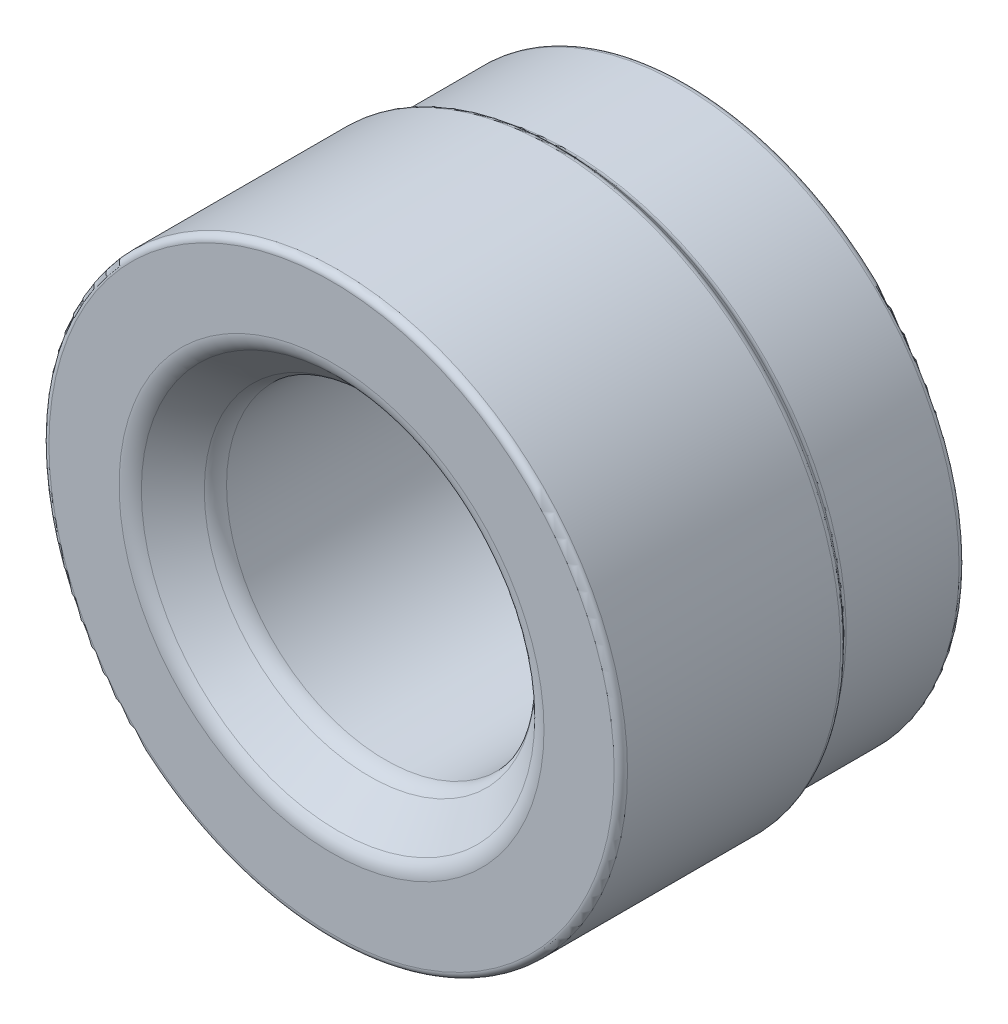
ISO-10303-21;
HEADER;
FILE_DESCRIPTION(('STEP AP214'),'2;1');
FILE_NAME('part.step','',(''),(''),'','','');
FILE_SCHEMA(('AUTOMOTIVE_DESIGN { 1 0 10303 214 1 1 1 1 }'));
ENDSEC;
DATA;
#1=APPLICATION_CONTEXT('core data for automotive mechanical design processes');
#2=APPLICATION_PROTOCOL_DEFINITION('international standard','automotive_design',2000,#1);
#3=PRODUCT_CONTEXT('',#1,'mechanical');
#4=PRODUCT('Part','Part','',(#3));
#5=PRODUCT_RELATED_PRODUCT_CATEGORY('part','',(#4));
#6=PRODUCT_DEFINITION_FORMATION('','',#4);
#7=PRODUCT_DEFINITION_CONTEXT('part definition',#1,'design');
#8=PRODUCT_DEFINITION('design','',#6,#7);
#9=PRODUCT_DEFINITION_SHAPE('','',#8);
#10=(LENGTH_UNIT() NAMED_UNIT(*) SI_UNIT(.MILLI.,.METRE.));
#11=(NAMED_UNIT(*) PLANE_ANGLE_UNIT() SI_UNIT($,.RADIAN.));
#12=(NAMED_UNIT(*) SI_UNIT($,.STERADIAN.) SOLID_ANGLE_UNIT());
#13=UNCERTAINTY_MEASURE_WITH_UNIT(LENGTH_MEASURE(1.E-05),#10,'distance_accuracy_value','');
#14=(GEOMETRIC_REPRESENTATION_CONTEXT(3) GLOBAL_UNCERTAINTY_ASSIGNED_CONTEXT((#13)) GLOBAL_UNIT_ASSIGNED_CONTEXT((#10,
#11,#12)) REPRESENTATION_CONTEXT('',''));
#15=CARTESIAN_POINT('',(0.,0.,0.));
#16=DIRECTION('',(0.,0.,1.));
#17=DIRECTION('',(1.,0.,0.));
#18=AXIS2_PLACEMENT_3D('',#15,#16,#17);
#19=CARTESIAN_POINT('',(0.,0.,8.76));
#20=DIRECTION('',(0.,0.,-1.));
#21=DIRECTION('',(-1.,0.,0.));
#22=AXIS2_PLACEMENT_3D('',#19,#20,#21);
#23=CYLINDRICAL_SURFACE('',#22,12.5);
#24=CARTESIAN_POINT('',(0.,0.,3.06));
#25=DIRECTION('',(0.,0.,1.));
#26=DIRECTION('',(1.,0.,0.));
#27=AXIS2_PLACEMENT_3D('',#24,#25,#26);
#28=CIRCLE('',#27,12.5);
#29=CARTESIAN_POINT('',(12.5,0.,3.06));
#30=VERTEX_POINT('',#29);
#31=EDGE_CURVE('E46',#30,#30,#28,.T.);
#32=ORIENTED_EDGE('',*,*,#31,.T.);
#33=EDGE_LOOP('',(#32));
#34=FACE_BOUND('',#33,.T.);
#35=CARTESIAN_POINT('',(0.,0.,8.13573593128808));
#36=DIRECTION('',(0.,0.,-1.));
#37=DIRECTION('',(-1.,0.,0.));
#38=AXIS2_PLACEMENT_3D('',#35,#36,#37);
#39=CIRCLE('',#38,12.5);
#40=CARTESIAN_POINT('',(-12.5,0.,8.13573593128808));
#41=VERTEX_POINT('',#40);
#42=EDGE_CURVE('E49',#41,#41,#39,.T.);
#43=ORIENTED_EDGE('',*,*,#42,.T.);
#44=EDGE_LOOP('',(#43));
#45=FACE_BOUND('',#44,.T.);
#46=ADVANCED_FACE('F39',(#34,#45),#23,.T.);
#47=CARTESIAN_POINT('',(0.,0.,2.76));
#48=DIRECTION('',(0.,0.,1.));
#49=DIRECTION('',(1.,0.,0.));
#50=AXIS2_PLACEMENT_3D('',#47,#48,#49);
#51=PLANE('',#50);
#52=CARTESIAN_POINT('',(0.,0.,2.76));
#53=DIRECTION('',(0.,0.,1.));
#54=DIRECTION('',(1.,0.,0.));
#55=AXIS2_PLACEMENT_3D('',#52,#53,#54);
#56=CIRCLE('',#55,12.2);
#57=CARTESIAN_POINT('',(12.2,0.,2.76));
#58=VERTEX_POINT('',#57);
#59=EDGE_CURVE('E10',#58,#58,#56,.F.);
#60=ORIENTED_EDGE('',*,*,#59,.T.);
#61=EDGE_LOOP('',(#60));
#62=FACE_BOUND('',#61,.T.);
#63=CARTESIAN_POINT('',(0.,0.,2.76));
#64=DIRECTION('',(0.,0.,1.));
#65=DIRECTION('',(1.,0.,0.));
#66=AXIS2_PLACEMENT_3D('',#63,#64,#65);
#67=CIRCLE('',#66,9.54704264399074);
#68=CARTESIAN_POINT('',(9.54704264399074,0.,2.76));
#69=VERTEX_POINT('',#68);
#70=EDGE_CURVE('E86',#69,#69,#67,.T.);
#71=ORIENTED_EDGE('',*,*,#70,.T.);
#72=EDGE_LOOP('',(#71));
#73=FACE_BOUND('',#72,.T.);
#74=ADVANCED_FACE('F120',(#62,#73),#51,.F.);
#75=CARTESIAN_POINT('',(0.,0.,18.76));
#76=DIRECTION('',(0.,0.,-1.));
#77=DIRECTION('',(-1.,0.,0.));
#78=AXIS2_PLACEMENT_3D('',#75,#76,#77);
#79=CYLINDRICAL_SURFACE('',#78,13.);
#80=CARTESIAN_POINT('',(0.,0.,8.88426406871194));
#81=DIRECTION('',(0.,0.,-1.));
#82=DIRECTION('',(-1.,0.,0.));
#83=AXIS2_PLACEMENT_3D('',#80,#81,#82);
#84=CIRCLE('',#83,13.);
#85=CARTESIAN_POINT('',(-13.,0.,8.88426406871194));
#86=VERTEX_POINT('',#85);
#87=EDGE_CURVE('E61',#86,#86,#84,.F.);
#88=ORIENTED_EDGE('',*,*,#87,.T.);
#89=EDGE_LOOP('',(#88));
#90=FACE_BOUND('',#89,.T.);
#91=CARTESIAN_POINT('',(0.,0.,18.46));
#92=DIRECTION('',(0.,0.,1.));
#93=DIRECTION('',(1.,0.,0.));
#94=AXIS2_PLACEMENT_3D('',#91,#92,#93);
#95=CIRCLE('',#94,13.);
#96=CARTESIAN_POINT('',(13.,0.,18.46));
#97=VERTEX_POINT('',#96);
#98=EDGE_CURVE('E88',#97,#97,#95,.F.);
#99=ORIENTED_EDGE('',*,*,#98,.T.);
#100=EDGE_LOOP('',(#99));
#101=FACE_BOUND('',#100,.T.);
#102=ADVANCED_FACE('F109',(#90,#101),#79,.T.);
#103=CARTESIAN_POINT('',(0.,0.,18.76));
#104=DIRECTION('',(0.,0.,1.));
#105=DIRECTION('',(1.,0.,0.));
#106=AXIS2_PLACEMENT_3D('',#103,#104,#105);
#107=PLANE('',#106);
#108=CARTESIAN_POINT('',(0.,0.,18.76));
#109=DIRECTION('',(0.,0.,1.));
#110=DIRECTION('',(1.,0.,0.));
#111=AXIS2_PLACEMENT_3D('',#108,#109,#110);
#112=CIRCLE('',#111,9.54704264399076);
#113=CARTESIAN_POINT('',(9.54704264399076,0.,18.76));
#114=VERTEX_POINT('',#113);
#115=EDGE_CURVE('E80',#114,#114,#112,.F.);
#116=ORIENTED_EDGE('',*,*,#115,.T.);
#117=EDGE_LOOP('',(#116));
#118=FACE_BOUND('',#117,.T.);
#119=CARTESIAN_POINT('',(0.,0.,18.76));
#120=DIRECTION('',(0.,0.,1.));
#121=DIRECTION('',(1.,0.,0.));
#122=AXIS2_PLACEMENT_3D('',#119,#120,#121);
#123=CIRCLE('',#122,12.7);
#124=CARTESIAN_POINT('',(12.7,0.,18.76));
#125=VERTEX_POINT('',#124);
#126=EDGE_CURVE('E95',#125,#125,#123,.T.);
#127=ORIENTED_EDGE('',*,*,#126,.T.);
#128=EDGE_LOOP('',(#127));
#129=FACE_BOUND('',#128,.T.);
#130=ADVANCED_FACE('F98',(#118,#129),#107,.T.);
#131=CARTESIAN_POINT('',(0.,0.,18.46));
#132=DIRECTION('',(0.,0.,1.));
#133=DIRECTION('',(1.,0.,0.));
#134=AXIS2_PLACEMENT_3D('',#131,#132,#133);
#135=TOROIDAL_SURFACE('',#134,12.7,0.3);
#136=ORIENTED_EDGE('',*,*,#98,.F.);
#137=EDGE_LOOP('',(#136));
#138=FACE_BOUND('',#137,.T.);
#139=ORIENTED_EDGE('',*,*,#126,.F.);
#140=EDGE_LOOP('',(#139));
#141=FACE_BOUND('',#140,.T.);
#142=ADVANCED_FACE('F96',(#138,#141),#135,.T.);
#143=CARTESIAN_POINT('',(0.,0.,-12.24));
#144=DIRECTION('',(0.,0.,1.));
#145=DIRECTION('',(1.,0.,0.));
#146=AXIS2_PLACEMENT_3D('',#143,#144,#145);
#147=CYLINDRICAL_SURFACE('',#146,7.13282908161765);
#148=CARTESIAN_POINT('',(0.,0.,16.3457864376269));
#149=DIRECTION('',(0.,0.,-1.));
#150=DIRECTION('',(-1.,0.,0.));
#151=AXIS2_PLACEMENT_3D('',#148,#149,#150);
#152=CIRCLE('',#151,7.13282908161765);
#153=CARTESIAN_POINT('',(-7.13282908161765,0.,16.3457864376269));
#154=VERTEX_POINT('',#153);
#155=EDGE_CURVE('E62',#154,#154,#152,.F.);
#156=ORIENTED_EDGE('',*,*,#155,.T.);
#157=EDGE_LOOP('',(#156));
#158=FACE_BOUND('',#157,.T.);
#159=CARTESIAN_POINT('',(0.,0.,5.1742135623731));
#160=DIRECTION('',(0.,0.,1.));
#161=DIRECTION('',(1.,0.,0.));
#162=AXIS2_PLACEMENT_3D('',#159,#160,#161);
#163=CIRCLE('',#162,7.13282908161765);
#164=CARTESIAN_POINT('',(7.13282908161765,0.,5.1742135623731));
#165=VERTEX_POINT('',#164);
#166=EDGE_CURVE('E69',#165,#165,#163,.F.);
#167=ORIENTED_EDGE('',*,*,#166,.T.);
#168=EDGE_LOOP('',(#167));
#169=FACE_BOUND('',#168,.T.);
#170=ADVANCED_FACE('F99',(#158,#169),#147,.F.);
#171=CARTESIAN_POINT('',(0.,0.,2.76));
#172=DIRECTION('',(0.,0.,-1.));
#173=DIRECTION('',(-1.,0.,0.));
#174=AXIS2_PLACEMENT_3D('',#171,#172,#173);
#175=CONICAL_SURFACE('',#174,9.13282908161765,0.785398163397447);
#176=CARTESIAN_POINT('',(0.,0.,3.05289321881345));
#177=DIRECTION('',(0.,0.,-1.));
#178=DIRECTION('',(-1.,0.,0.));
#179=AXIS2_PLACEMENT_3D('',#176,#177,#178);
#180=CIRCLE('',#179,8.8399358628042);
#181=CARTESIAN_POINT('',(-8.8399358628042,0.,3.05289321881345));
#182=VERTEX_POINT('',#181);
#183=EDGE_CURVE('E78',#182,#182,#180,.T.);
#184=ORIENTED_EDGE('',*,*,#183,.T.);
#185=EDGE_LOOP('',(#184));
#186=FACE_BOUND('',#185,.T.);
#187=CARTESIAN_POINT('',(0.,0.,4.46710678118655));
#188=DIRECTION('',(0.,0.,-1.));
#189=DIRECTION('',(-1.,0.,0.));
#190=AXIS2_PLACEMENT_3D('',#187,#188,#189);
#191=CIRCLE('',#190,7.4257223004311);
#192=CARTESIAN_POINT('',(-7.4257223004311,0.,4.46710678118655));
#193=VERTEX_POINT('',#192);
#194=EDGE_CURVE('E85',#193,#193,#191,.F.);
#195=ORIENTED_EDGE('',*,*,#194,.T.);
#196=EDGE_LOOP('',(#195));
#197=FACE_BOUND('',#196,.T.);
#198=ADVANCED_FACE('F110',(#186,#197),#175,.F.);
#199=CARTESIAN_POINT('',(0.,0.,16.76));
#200=DIRECTION('',(0.,0.,1.));
#201=DIRECTION('',(1.,0.,0.));
#202=AXIS2_PLACEMENT_3D('',#199,#200,#201);
#203=CONICAL_SURFACE('',#202,7.13282908161765,0.785398163397452);
#204=CARTESIAN_POINT('',(0.,0.,18.4671067811865));
#205=DIRECTION('',(0.,0.,-1.));
#206=DIRECTION('',(-1.,0.,0.));
#207=AXIS2_PLACEMENT_3D('',#204,#205,#206);
#208=CIRCLE('',#207,8.83993586280422);
#209=CARTESIAN_POINT('',(-8.83993586280422,0.,18.4671067811865));
#210=VERTEX_POINT('',#209);
#211=EDGE_CURVE('E73',#210,#210,#208,.F.);
#212=ORIENTED_EDGE('',*,*,#211,.T.);
#213=EDGE_LOOP('',(#212));
#214=FACE_BOUND('',#213,.T.);
#215=CARTESIAN_POINT('',(0.,0.,17.0528932188134));
#216=DIRECTION('',(0.,0.,1.));
#217=DIRECTION('',(1.,0.,0.));
#218=AXIS2_PLACEMENT_3D('',#215,#216,#217);
#219=CIRCLE('',#218,7.42572230043111);
#220=CARTESIAN_POINT('',(7.42572230043111,0.,17.0528932188134));
#221=VERTEX_POINT('',#220);
#222=EDGE_CURVE('E75',#221,#221,#219,.F.);
#223=ORIENTED_EDGE('',*,*,#222,.T.);
#224=EDGE_LOOP('',(#223));
#225=FACE_BOUND('',#224,.T.);
#226=ADVANCED_FACE('F164',(#214,#225),#203,.F.);
#227=CARTESIAN_POINT('',(0.,0.,3.76));
#228=DIRECTION('',(0.,0.,1.));
#229=DIRECTION('',(1.,0.,0.));
#230=AXIS2_PLACEMENT_3D('',#227,#228,#229);
#231=TOROIDAL_SURFACE('',#230,9.54704264399074,1.);
#232=ORIENTED_EDGE('',*,*,#183,.F.);
#233=EDGE_LOOP('',(#232));
#234=FACE_BOUND('',#233,.T.);
#235=ORIENTED_EDGE('',*,*,#70,.F.);
#236=EDGE_LOOP('',(#235));
#237=FACE_BOUND('',#236,.T.);
#238=ADVANCED_FACE('F163',(#234,#237),#231,.T.);
#239=CARTESIAN_POINT('',(0.,0.,17.76));
#240=DIRECTION('',(0.,0.,1.));
#241=DIRECTION('',(1.,0.,0.));
#242=AXIS2_PLACEMENT_3D('',#239,#240,#241);
#243=TOROIDAL_SURFACE('',#242,9.54704264399076,1.);
#244=ORIENTED_EDGE('',*,*,#211,.F.);
#245=EDGE_LOOP('',(#244));
#246=FACE_BOUND('',#245,.T.);
#247=ORIENTED_EDGE('',*,*,#115,.F.);
#248=EDGE_LOOP('',(#247));
#249=FACE_BOUND('',#248,.T.);
#250=ADVANCED_FACE('F160',(#246,#249),#243,.T.);
#251=CARTESIAN_POINT('',(0.,0.,16.3457864376269));
#252=DIRECTION('',(0.,0.,-1.));
#253=DIRECTION('',(-1.,0.,0.));
#254=AXIS2_PLACEMENT_3D('',#251,#252,#253);
#255=TOROIDAL_SURFACE('',#254,8.13282908161765,1.);
#256=ORIENTED_EDGE('',*,*,#222,.F.);
#257=EDGE_LOOP('',(#256));
#258=FACE_BOUND('',#257,.T.);
#259=ORIENTED_EDGE('',*,*,#155,.F.);
#260=EDGE_LOOP('',(#259));
#261=FACE_BOUND('',#260,.T.);
#262=ADVANCED_FACE('F154',(#258,#261),#255,.T.);
#263=CARTESIAN_POINT('',(0.,0.,5.1742135623731));
#264=DIRECTION('',(0.,0.,1.));
#265=DIRECTION('',(1.,0.,0.));
#266=AXIS2_PLACEMENT_3D('',#263,#264,#265);
#267=TOROIDAL_SURFACE('',#266,8.13282908161765,1.);
#268=ORIENTED_EDGE('',*,*,#194,.F.);
#269=EDGE_LOOP('',(#268));
#270=FACE_BOUND('',#269,.T.);
#271=ORIENTED_EDGE('',*,*,#166,.F.);
#272=EDGE_LOOP('',(#271));
#273=FACE_BOUND('',#272,.T.);
#274=ADVANCED_FACE('F141',(#270,#273),#267,.T.);
#275=CARTESIAN_POINT('',(0.,0.,8.76));
#276=DIRECTION('',(0.,0.,1.));
#277=DIRECTION('',(1.,0.,0.));
#278=AXIS2_PLACEMENT_3D('',#275,#276,#277);
#279=CONICAL_SURFACE('',#278,13.,0.78539816339745);
#280=CARTESIAN_POINT('',(0.,0.,8.67213203435597));
#281=DIRECTION('',(0.,0.,-1.));
#282=DIRECTION('',(-1.,0.,0.));
#283=AXIS2_PLACEMENT_3D('',#280,#281,#282);
#284=CIRCLE('',#283,12.912132034356);
#285=CARTESIAN_POINT('',(-12.912132034356,0.,8.67213203435597));
#286=VERTEX_POINT('',#285);
#287=EDGE_CURVE('E53',#286,#286,#284,.T.);
#288=ORIENTED_EDGE('',*,*,#287,.T.);
#289=EDGE_LOOP('',(#288));
#290=FACE_BOUND('',#289,.T.);
#291=CARTESIAN_POINT('',(0.,0.,8.34786796564404));
#292=DIRECTION('',(0.,0.,1.));
#293=DIRECTION('',(1.,0.,0.));
#294=AXIS2_PLACEMENT_3D('',#291,#292,#293);
#295=CIRCLE('',#294,12.587867965644);
#296=CARTESIAN_POINT('',(12.587867965644,0.,8.34786796564404));
#297=VERTEX_POINT('',#296);
#298=EDGE_CURVE('E56',#297,#297,#295,.T.);
#299=ORIENTED_EDGE('',*,*,#298,.T.);
#300=EDGE_LOOP('',(#299));
#301=FACE_BOUND('',#300,.T.);
#302=ADVANCED_FACE('F139',(#290,#301),#279,.T.);
#303=CARTESIAN_POINT('',(0.,0.,8.88426406871194));
#304=DIRECTION('',(0.,0.,-1.));
#305=DIRECTION('',(-1.,0.,0.));
#306=AXIS2_PLACEMENT_3D('',#303,#304,#305);
#307=TOROIDAL_SURFACE('',#306,12.7,0.3);
#308=ORIENTED_EDGE('',*,*,#287,.F.);
#309=EDGE_LOOP('',(#308));
#310=FACE_BOUND('',#309,.T.);
#311=ORIENTED_EDGE('',*,*,#87,.F.);
#312=EDGE_LOOP('',(#311));
#313=FACE_BOUND('',#312,.T.);
#314=ADVANCED_FACE('F133',(#310,#313),#307,.T.);
#315=CARTESIAN_POINT('',(0.,0.,8.13573593128808));
#316=DIRECTION('',(0.,0.,-1.));
#317=DIRECTION('',(-1.,0.,0.));
#318=AXIS2_PLACEMENT_3D('',#315,#316,#317);
#319=TOROIDAL_SURFACE('',#318,12.8,0.3);
#320=ORIENTED_EDGE('',*,*,#298,.F.);
#321=EDGE_LOOP('',(#320));
#322=FACE_BOUND('',#321,.T.);
#323=ORIENTED_EDGE('',*,*,#42,.F.);
#324=EDGE_LOOP('',(#323));
#325=FACE_BOUND('',#324,.T.);
#326=ADVANCED_FACE('F138',(#322,#325),#319,.F.);
#327=CARTESIAN_POINT('',(0.,0.,3.06));
#328=DIRECTION('',(0.,0.,1.));
#329=DIRECTION('',(1.,0.,0.));
#330=AXIS2_PLACEMENT_3D('',#327,#328,#329);
#331=TOROIDAL_SURFACE('',#330,12.2,0.3);
#332=ORIENTED_EDGE('',*,*,#59,.F.);
#333=EDGE_LOOP('',(#332));
#334=FACE_BOUND('',#333,.T.);
#335=ORIENTED_EDGE('',*,*,#31,.F.);
#336=EDGE_LOOP('',(#335));
#337=FACE_BOUND('',#336,.T.);
#338=ADVANCED_FACE('F41',(#334,#337),#331,.T.);
#339=CLOSED_SHELL('',(#46,#74,#102,#130,#142,#170,#198,#226,#238,#250,#262,#274,#302,#314,#326,#338));
#340=MANIFOLD_SOLID_BREP('B2',#339);
#341=ADVANCED_BREP_SHAPE_REPRESENTATION('',(#18,#340),#14);
#342=SHAPE_DEFINITION_REPRESENTATION(#9,#341);
ENDSEC;
END-ISO-10303-21;
